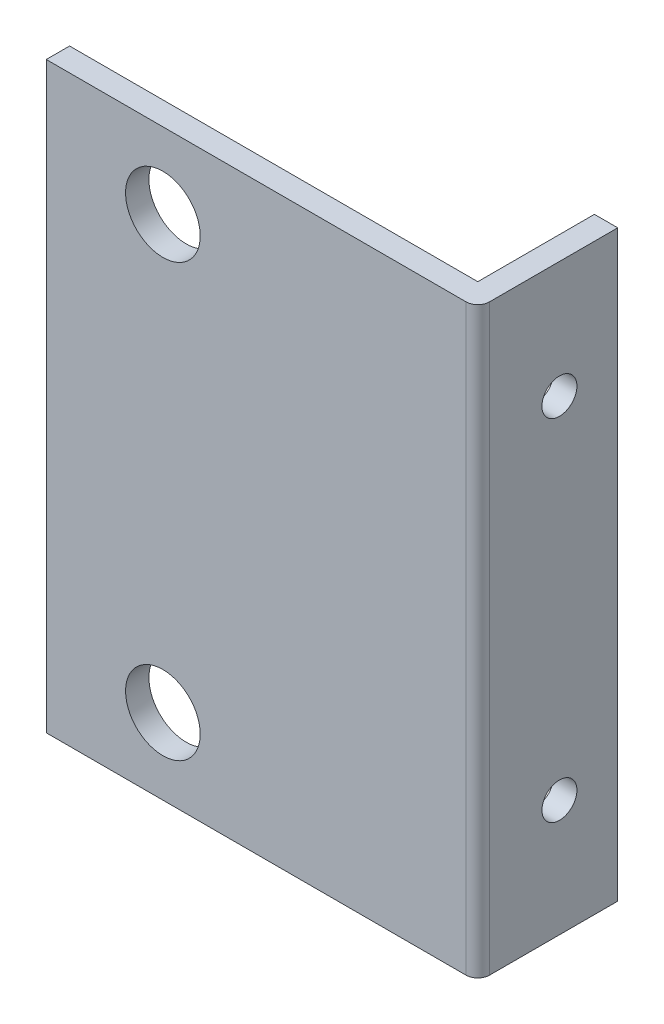
ISO-10303-21;
HEADER;
FILE_DESCRIPTION(('STEP AP214'),'2;1');
FILE_NAME('part.step','',(''),(''),'','','');
FILE_SCHEMA(('AUTOMOTIVE_DESIGN { 1 0 10303 214 1 1 1 1 }'));
ENDSEC;
DATA;
#1=APPLICATION_CONTEXT('core data for automotive mechanical design processes');
#2=APPLICATION_PROTOCOL_DEFINITION('international standard','automotive_design',2000,#1);
#3=PRODUCT_CONTEXT('',#1,'mechanical');
#4=PRODUCT('Part','Part','',(#3));
#5=PRODUCT_RELATED_PRODUCT_CATEGORY('part','',(#4));
#6=PRODUCT_DEFINITION_FORMATION('','',#4);
#7=PRODUCT_DEFINITION_CONTEXT('part definition',#1,'design');
#8=PRODUCT_DEFINITION('design','',#6,#7);
#9=PRODUCT_DEFINITION_SHAPE('','',#8);
#10=(LENGTH_UNIT() NAMED_UNIT(*) SI_UNIT(.MILLI.,.METRE.));
#11=(NAMED_UNIT(*) PLANE_ANGLE_UNIT() SI_UNIT($,.RADIAN.));
#12=(NAMED_UNIT(*) SI_UNIT($,.STERADIAN.) SOLID_ANGLE_UNIT());
#13=UNCERTAINTY_MEASURE_WITH_UNIT(LENGTH_MEASURE(1.E-05),#10,'distance_accuracy_value','');
#14=(GEOMETRIC_REPRESENTATION_CONTEXT(3) GLOBAL_UNCERTAINTY_ASSIGNED_CONTEXT((#13)) GLOBAL_UNIT_ASSIGNED_CONTEXT((#10,
#11,#12)) REPRESENTATION_CONTEXT('',''));
#15=CARTESIAN_POINT('',(0.,0.,0.));
#16=DIRECTION('',(0.,0.,1.));
#17=DIRECTION('',(1.,0.,0.));
#18=AXIS2_PLACEMENT_3D('',#15,#16,#17);
#19=CARTESIAN_POINT('',(0.,50.,-2.));
#20=DIRECTION('',(1.,0.,0.));
#21=DIRECTION('',(0.,0.,-1.));
#22=AXIS2_PLACEMENT_3D('',#19,#20,#21);
#23=PLANE('',#22);
#24=DIRECTION('',(0.,0.,1.));
#25=VECTOR('',#24,1.);
#26=CARTESIAN_POINT('',(0.,0.,-2.));
#27=LINE('',#26,#25);
#28=CARTESIAN_POINT('',(0.,0.,-2.));
#29=VERTEX_POINT('',#28);
#30=CARTESIAN_POINT('',(0.,0.,0.));
#31=VERTEX_POINT('',#30);
#32=EDGE_CURVE('E111',#29,#31,#27,.T.);
#33=ORIENTED_EDGE('',*,*,#32,.T.);
#34=DIRECTION('',(0.,-1.,0.));
#35=VECTOR('',#34,1.);
#36=CARTESIAN_POINT('',(0.,50.,0.));
#37=LINE('',#36,#35);
#38=CARTESIAN_POINT('',(0.,50.,0.));
#39=VERTEX_POINT('',#38);
#40=EDGE_CURVE('E94',#39,#31,#37,.T.);
#41=ORIENTED_EDGE('',*,*,#40,.F.);
#42=DIRECTION('',(0.,0.,1.));
#43=VECTOR('',#42,1.);
#44=CARTESIAN_POINT('',(0.,50.,-2.));
#45=LINE('',#44,#43);
#46=CARTESIAN_POINT('',(0.,50.,-2.));
#47=VERTEX_POINT('',#46);
#48=EDGE_CURVE('E99',#47,#39,#45,.T.);
#49=ORIENTED_EDGE('',*,*,#48,.F.);
#50=DIRECTION('',(0.,-1.,0.));
#51=VECTOR('',#50,1.);
#52=CARTESIAN_POINT('',(0.,50.,-2.));
#53=LINE('',#52,#51);
#54=EDGE_CURVE('E154',#47,#29,#53,.T.);
#55=ORIENTED_EDGE('',*,*,#54,.T.);
#56=EDGE_LOOP('',(#33,#41,#49,#55));
#57=FACE_BOUND('',#56,.T.);
#58=ADVANCED_FACE('F33',(#57),#23,.F.);
#59=CARTESIAN_POINT('',(0.,50.,0.));
#60=DIRECTION('',(0.,0.,-1.));
#61=DIRECTION('',(-1.,0.,0.));
#62=AXIS2_PLACEMENT_3D('',#59,#60,#61);
#63=PLANE('',#62);
#64=CARTESIAN_POINT('',(10.,6.50000000000001,0.));
#65=DIRECTION('',(0.,0.,1.));
#66=DIRECTION('',(-1.,0.,0.));
#67=AXIS2_PLACEMENT_3D('',#64,#65,#66);
#68=CIRCLE('',#67,3.2);
#69=CARTESIAN_POINT('',(6.8,6.50000000000001,0.));
#70=VERTEX_POINT('',#69);
#71=EDGE_CURVE('E143',#70,#70,#68,.T.);
#72=ORIENTED_EDGE('',*,*,#71,.F.);
#73=EDGE_LOOP('',(#72));
#74=FACE_BOUND('',#73,.T.);
#75=CARTESIAN_POINT('',(10.,43.5,0.));
#76=DIRECTION('',(0.,0.,1.));
#77=DIRECTION('',(1.,0.,0.));
#78=AXIS2_PLACEMENT_3D('',#75,#76,#77);
#79=CIRCLE('',#78,3.2);
#80=CARTESIAN_POINT('',(13.2,43.5,0.));
#81=VERTEX_POINT('',#80);
#82=EDGE_CURVE('E133',#81,#81,#79,.T.);
#83=ORIENTED_EDGE('',*,*,#82,.F.);
#84=EDGE_LOOP('',(#83));
#85=FACE_BOUND('',#84,.T.);
#86=DIRECTION('',(1.,0.,0.));
#87=VECTOR('',#86,1.);
#88=CARTESIAN_POINT('',(0.,0.,0.));
#89=LINE('',#88,#87);
#90=CARTESIAN_POINT('',(36.,0.,0.));
#91=VERTEX_POINT('',#90);
#92=EDGE_CURVE('E156',#31,#91,#89,.T.);
#93=ORIENTED_EDGE('',*,*,#92,.T.);
#94=DIRECTION('',(0.,-1.,0.));
#95=VECTOR('',#94,1.);
#96=CARTESIAN_POINT('',(36.,50.,0.));
#97=LINE('',#96,#95);
#98=CARTESIAN_POINT('',(36.,50.,0.));
#99=VERTEX_POINT('',#98);
#100=EDGE_CURVE('E42',#91,#99,#97,.F.);
#101=ORIENTED_EDGE('',*,*,#100,.T.);
#102=DIRECTION('',(1.,0.,0.));
#103=VECTOR('',#102,1.);
#104=CARTESIAN_POINT('',(0.,50.,0.));
#105=LINE('',#104,#103);
#106=EDGE_CURVE('E90',#39,#99,#105,.T.);
#107=ORIENTED_EDGE('',*,*,#106,.F.);
#108=ORIENTED_EDGE('',*,*,#40,.T.);
#109=EDGE_LOOP('',(#93,#101,#107,#108));
#110=FACE_BOUND('',#109,.T.);
#111=ADVANCED_FACE('F92',(#74,#85,#110),#63,.F.);
#112=CARTESIAN_POINT('',(37.,50.,0.));
#113=DIRECTION('',(-1.,0.,0.));
#114=DIRECTION('',(0.,0.,1.));
#115=AXIS2_PLACEMENT_3D('',#112,#113,#114);
#116=PLANE('',#115);
#117=CARTESIAN_POINT('',(37.,10.,-7.));
#118=DIRECTION('',(1.,0.,0.));
#119=DIRECTION('',(0.,0.,1.));
#120=AXIS2_PLACEMENT_3D('',#117,#118,#119);
#121=CIRCLE('',#120,1.5);
#122=CARTESIAN_POINT('',(37.,10.,-5.5));
#123=VERTEX_POINT('',#122);
#124=EDGE_CURVE('E130',#123,#123,#121,.T.);
#125=ORIENTED_EDGE('',*,*,#124,.F.);
#126=EDGE_LOOP('',(#125));
#127=FACE_BOUND('',#126,.T.);
#128=CARTESIAN_POINT('',(37.,40.,-7.));
#129=DIRECTION('',(1.,0.,0.));
#130=DIRECTION('',(0.,0.,-1.));
#131=AXIS2_PLACEMENT_3D('',#128,#129,#130);
#132=CIRCLE('',#131,1.5);
#133=CARTESIAN_POINT('',(37.,40.,-8.5));
#134=VERTEX_POINT('',#133);
#135=EDGE_CURVE('E127',#134,#134,#132,.T.);
#136=ORIENTED_EDGE('',*,*,#135,.F.);
#137=EDGE_LOOP('',(#136));
#138=FACE_BOUND('',#137,.T.);
#139=DIRECTION('',(0.,0.,-1.));
#140=VECTOR('',#139,1.);
#141=CARTESIAN_POINT('',(37.,50.,0.));
#142=LINE('',#141,#140);
#143=CARTESIAN_POINT('',(37.,50.,-1.));
#144=VERTEX_POINT('',#143);
#145=CARTESIAN_POINT('',(37.,50.,-12.));
#146=VERTEX_POINT('',#145);
#147=EDGE_CURVE('E98',#144,#146,#142,.T.);
#148=ORIENTED_EDGE('',*,*,#147,.F.);
#149=DIRECTION('',(0.,-1.,0.));
#150=VECTOR('',#149,1.);
#151=CARTESIAN_POINT('',(37.,50.,-1.));
#152=LINE('',#151,#150);
#153=CARTESIAN_POINT('',(37.,0.,-1.));
#154=VERTEX_POINT('',#153);
#155=EDGE_CURVE('E112',#144,#154,#152,.T.);
#156=ORIENTED_EDGE('',*,*,#155,.T.);
#157=DIRECTION('',(0.,0.,-1.));
#158=VECTOR('',#157,1.);
#159=CARTESIAN_POINT('',(37.,0.,0.));
#160=LINE('',#159,#158);
#161=CARTESIAN_POINT('',(37.,0.,-12.));
#162=VERTEX_POINT('',#161);
#163=EDGE_CURVE('E158',#154,#162,#160,.T.);
#164=ORIENTED_EDGE('',*,*,#163,.T.);
#165=DIRECTION('',(0.,-1.,0.));
#166=VECTOR('',#165,1.);
#167=CARTESIAN_POINT('',(37.,50.,-12.));
#168=LINE('',#167,#166);
#169=EDGE_CURVE('E113',#146,#162,#168,.T.);
#170=ORIENTED_EDGE('',*,*,#169,.F.);
#171=EDGE_LOOP('',(#148,#156,#164,#170));
#172=FACE_BOUND('',#171,.T.);
#173=ADVANCED_FACE('F200',(#127,#138,#172),#116,.F.);
#174=CARTESIAN_POINT('',(37.,50.,-12.));
#175=DIRECTION('',(0.,0.,1.));
#176=DIRECTION('',(1.,0.,0.));
#177=AXIS2_PLACEMENT_3D('',#174,#175,#176);
#178=PLANE('',#177);
#179=DIRECTION('',(-1.,0.,0.));
#180=VECTOR('',#179,1.);
#181=CARTESIAN_POINT('',(37.,0.,-12.));
#182=LINE('',#181,#180);
#183=CARTESIAN_POINT('',(35.,0.,-12.));
#184=VERTEX_POINT('',#183);
#185=EDGE_CURVE('E160',#162,#184,#182,.T.);
#186=ORIENTED_EDGE('',*,*,#185,.T.);
#187=DIRECTION('',(0.,-1.,0.));
#188=VECTOR('',#187,1.);
#189=CARTESIAN_POINT('',(35.,50.,-12.));
#190=LINE('',#189,#188);
#191=CARTESIAN_POINT('',(35.,50.,-12.));
#192=VERTEX_POINT('',#191);
#193=EDGE_CURVE('E118',#192,#184,#190,.T.);
#194=ORIENTED_EDGE('',*,*,#193,.F.);
#195=DIRECTION('',(-1.,0.,0.));
#196=VECTOR('',#195,1.);
#197=CARTESIAN_POINT('',(37.,50.,-12.));
#198=LINE('',#197,#196);
#199=EDGE_CURVE('E149',#146,#192,#198,.T.);
#200=ORIENTED_EDGE('',*,*,#199,.F.);
#201=ORIENTED_EDGE('',*,*,#169,.T.);
#202=EDGE_LOOP('',(#186,#194,#200,#201));
#203=FACE_BOUND('',#202,.T.);
#204=ADVANCED_FACE('F192',(#203),#178,.F.);
#205=CARTESIAN_POINT('',(35.,50.,-12.));
#206=DIRECTION('',(1.,0.,0.));
#207=DIRECTION('',(0.,0.,-1.));
#208=AXIS2_PLACEMENT_3D('',#205,#206,#207);
#209=PLANE('',#208);
#210=CARTESIAN_POINT('',(35.,10.,-7.));
#211=DIRECTION('',(1.,0.,0.));
#212=DIRECTION('',(0.,0.,-1.));
#213=AXIS2_PLACEMENT_3D('',#210,#211,#212);
#214=CIRCLE('',#213,1.5);
#215=CARTESIAN_POINT('',(35.,10.,-8.5));
#216=VERTEX_POINT('',#215);
#217=EDGE_CURVE('E128',#216,#216,#214,.T.);
#218=ORIENTED_EDGE('',*,*,#217,.T.);
#219=EDGE_LOOP('',(#218));
#220=FACE_BOUND('',#219,.T.);
#221=CARTESIAN_POINT('',(35.,40.,-7.));
#222=DIRECTION('',(1.,0.,0.));
#223=DIRECTION('',(0.,0.,-1.));
#224=AXIS2_PLACEMENT_3D('',#221,#222,#223);
#225=CIRCLE('',#224,1.5);
#226=CARTESIAN_POINT('',(35.,40.,-8.5));
#227=VERTEX_POINT('',#226);
#228=EDGE_CURVE('E124',#227,#227,#225,.T.);
#229=ORIENTED_EDGE('',*,*,#228,.T.);
#230=EDGE_LOOP('',(#229));
#231=FACE_BOUND('',#230,.T.);
#232=DIRECTION('',(0.,0.,1.));
#233=VECTOR('',#232,1.);
#234=CARTESIAN_POINT('',(35.,0.,-12.));
#235=LINE('',#234,#233);
#236=CARTESIAN_POINT('',(35.,0.,-2.));
#237=VERTEX_POINT('',#236);
#238=EDGE_CURVE('E162',#184,#237,#235,.T.);
#239=ORIENTED_EDGE('',*,*,#238,.T.);
#240=DIRECTION('',(0.,-1.,0.));
#241=VECTOR('',#240,1.);
#242=CARTESIAN_POINT('',(35.,50.,-2.));
#243=LINE('',#242,#241);
#244=CARTESIAN_POINT('',(35.,50.,-2.));
#245=VERTEX_POINT('',#244);
#246=EDGE_CURVE('E166',#245,#237,#243,.T.);
#247=ORIENTED_EDGE('',*,*,#246,.F.);
#248=DIRECTION('',(0.,0.,1.));
#249=VECTOR('',#248,1.);
#250=CARTESIAN_POINT('',(35.,50.,-12.));
#251=LINE('',#250,#249);
#252=EDGE_CURVE('E151',#192,#245,#251,.T.);
#253=ORIENTED_EDGE('',*,*,#252,.F.);
#254=ORIENTED_EDGE('',*,*,#193,.T.);
#255=EDGE_LOOP('',(#239,#247,#253,#254));
#256=FACE_BOUND('',#255,.T.);
#257=ADVANCED_FACE('F173',(#220,#231,#256),#209,.F.);
#258=CARTESIAN_POINT('',(35.,50.,-2.));
#259=DIRECTION('',(0.,0.,1.));
#260=DIRECTION('',(1.,0.,0.));
#261=AXIS2_PLACEMENT_3D('',#258,#259,#260);
#262=PLANE('',#261);
#263=CARTESIAN_POINT('',(10.,6.50000000000001,-2.));
#264=DIRECTION('',(0.,0.,1.));
#265=DIRECTION('',(1.,0.,0.));
#266=AXIS2_PLACEMENT_3D('',#263,#264,#265);
#267=CIRCLE('',#266,3.2);
#268=CARTESIAN_POINT('',(13.2,6.50000000000001,-2.));
#269=VERTEX_POINT('',#268);
#270=EDGE_CURVE('E37',#269,#269,#267,.T.);
#271=ORIENTED_EDGE('',*,*,#270,.T.);
#272=EDGE_LOOP('',(#271));
#273=FACE_BOUND('',#272,.T.);
#274=CARTESIAN_POINT('',(10.,43.5,-2.));
#275=DIRECTION('',(0.,0.,1.));
#276=DIRECTION('',(1.,0.,0.));
#277=AXIS2_PLACEMENT_3D('',#274,#275,#276);
#278=CIRCLE('',#277,3.2);
#279=CARTESIAN_POINT('',(13.2,43.5,-2.));
#280=VERTEX_POINT('',#279);
#281=EDGE_CURVE('E131',#280,#280,#278,.T.);
#282=ORIENTED_EDGE('',*,*,#281,.T.);
#283=EDGE_LOOP('',(#282));
#284=FACE_BOUND('',#283,.T.);
#285=DIRECTION('',(-1.,0.,0.));
#286=VECTOR('',#285,1.);
#287=CARTESIAN_POINT('',(35.,0.,-2.));
#288=LINE('',#287,#286);
#289=EDGE_CURVE('E108',#237,#29,#288,.T.);
#290=ORIENTED_EDGE('',*,*,#289,.T.);
#291=ORIENTED_EDGE('',*,*,#54,.F.);
#292=DIRECTION('',(-1.,0.,0.));
#293=VECTOR('',#292,1.);
#294=CARTESIAN_POINT('',(35.,50.,-2.));
#295=LINE('',#294,#293);
#296=EDGE_CURVE('E104',#245,#47,#295,.T.);
#297=ORIENTED_EDGE('',*,*,#296,.F.);
#298=ORIENTED_EDGE('',*,*,#246,.T.);
#299=EDGE_LOOP('',(#290,#291,#297,#298));
#300=FACE_BOUND('',#299,.T.);
#301=ADVANCED_FACE('F181',(#273,#284,#300),#262,.F.);
#302=CARTESIAN_POINT('',(0.,50.,0.));
#303=DIRECTION('',(0.,1.,0.));
#304=DIRECTION('',(0.,0.,1.));
#305=AXIS2_PLACEMENT_3D('',#302,#303,#304);
#306=PLANE('',#305);
#307=ORIENTED_EDGE('',*,*,#106,.T.);
#308=CARTESIAN_POINT('',(36.,50.,-1.));
#309=DIRECTION('',(0.,1.,0.));
#310=DIRECTION('',(0.,0.,1.));
#311=AXIS2_PLACEMENT_3D('',#308,#309,#310);
#312=CIRCLE('',#311,1.);
#313=EDGE_CURVE('E11',#99,#144,#312,.T.);
#314=ORIENTED_EDGE('',*,*,#313,.T.);
#315=ORIENTED_EDGE('',*,*,#147,.T.);
#316=ORIENTED_EDGE('',*,*,#199,.T.);
#317=ORIENTED_EDGE('',*,*,#252,.T.);
#318=ORIENTED_EDGE('',*,*,#296,.T.);
#319=ORIENTED_EDGE('',*,*,#48,.T.);
#320=EDGE_LOOP('',(#307,#314,#315,#316,#317,#318,#319));
#321=FACE_BOUND('',#320,.T.);
#322=ADVANCED_FACE('F102',(#321),#306,.T.);
#323=CARTESIAN_POINT('',(0.,0.,0.));
#324=DIRECTION('',(0.,1.,0.));
#325=DIRECTION('',(0.,0.,1.));
#326=AXIS2_PLACEMENT_3D('',#323,#324,#325);
#327=PLANE('',#326);
#328=ORIENTED_EDGE('',*,*,#163,.F.);
#329=CARTESIAN_POINT('',(36.,0.,-1.));
#330=DIRECTION('',(0.,1.,0.));
#331=DIRECTION('',(0.,0.,1.));
#332=AXIS2_PLACEMENT_3D('',#329,#330,#331);
#333=CIRCLE('',#332,1.);
#334=EDGE_CURVE('E57',#154,#91,#333,.F.);
#335=ORIENTED_EDGE('',*,*,#334,.T.);
#336=ORIENTED_EDGE('',*,*,#92,.F.);
#337=ORIENTED_EDGE('',*,*,#32,.F.);
#338=ORIENTED_EDGE('',*,*,#289,.F.);
#339=ORIENTED_EDGE('',*,*,#238,.F.);
#340=ORIENTED_EDGE('',*,*,#185,.F.);
#341=EDGE_LOOP('',(#328,#335,#336,#337,#338,#339,#340));
#342=FACE_BOUND('',#341,.T.);
#343=ADVANCED_FACE('F179',(#342),#327,.F.);
#344=CARTESIAN_POINT('',(36.,50.,-1.));
#345=DIRECTION('',(0.,-1.,0.));
#346=DIRECTION('',(0.,0.,-1.));
#347=AXIS2_PLACEMENT_3D('',#344,#345,#346);
#348=CYLINDRICAL_SURFACE('',#347,1.);
#349=ORIENTED_EDGE('',*,*,#313,.F.);
#350=ORIENTED_EDGE('',*,*,#100,.F.);
#351=ORIENTED_EDGE('',*,*,#334,.F.);
#352=ORIENTED_EDGE('',*,*,#155,.F.);
#353=EDGE_LOOP('',(#349,#350,#351,#352));
#354=FACE_BOUND('',#353,.T.);
#355=ADVANCED_FACE('F35',(#354),#348,.T.);
#356=CARTESIAN_POINT('',(0.,40.,-7.));
#357=DIRECTION('',(1.,0.,0.));
#358=DIRECTION('',(0.,0.,-1.));
#359=AXIS2_PLACEMENT_3D('',#356,#357,#358);
#360=CYLINDRICAL_SURFACE('',#359,1.5);
#361=ORIENTED_EDGE('',*,*,#135,.T.);
#362=EDGE_LOOP('',(#361));
#363=FACE_BOUND('',#362,.T.);
#364=ORIENTED_EDGE('',*,*,#228,.F.);
#365=EDGE_LOOP('',(#364));
#366=FACE_BOUND('',#365,.T.);
#367=ADVANCED_FACE('F216',(#363,#366),#360,.F.);
#368=CARTESIAN_POINT('',(0.,10.,-7.));
#369=DIRECTION('',(1.,0.,0.));
#370=DIRECTION('',(0.,0.,-1.));
#371=AXIS2_PLACEMENT_3D('',#368,#369,#370);
#372=CYLINDRICAL_SURFACE('',#371,1.5);
#373=ORIENTED_EDGE('',*,*,#124,.T.);
#374=EDGE_LOOP('',(#373));
#375=FACE_BOUND('',#374,.T.);
#376=ORIENTED_EDGE('',*,*,#217,.F.);
#377=EDGE_LOOP('',(#376));
#378=FACE_BOUND('',#377,.T.);
#379=ADVANCED_FACE('F221',(#375,#378),#372,.F.);
#380=CARTESIAN_POINT('',(10.,43.5,-12.));
#381=DIRECTION('',(0.,0.,1.));
#382=DIRECTION('',(1.,0.,0.));
#383=AXIS2_PLACEMENT_3D('',#380,#381,#382);
#384=CYLINDRICAL_SURFACE('',#383,3.2);
#385=ORIENTED_EDGE('',*,*,#82,.T.);
#386=EDGE_LOOP('',(#385));
#387=FACE_BOUND('',#386,.T.);
#388=ORIENTED_EDGE('',*,*,#281,.F.);
#389=EDGE_LOOP('',(#388));
#390=FACE_BOUND('',#389,.T.);
#391=ADVANCED_FACE('F229',(#387,#390),#384,.F.);
#392=CARTESIAN_POINT('',(10.,6.50000000000001,-12.));
#393=DIRECTION('',(0.,0.,1.));
#394=DIRECTION('',(1.,0.,0.));
#395=AXIS2_PLACEMENT_3D('',#392,#393,#394);
#396=CYLINDRICAL_SURFACE('',#395,3.2);
#397=ORIENTED_EDGE('',*,*,#71,.T.);
#398=EDGE_LOOP('',(#397));
#399=FACE_BOUND('',#398,.T.);
#400=ORIENTED_EDGE('',*,*,#270,.F.);
#401=EDGE_LOOP('',(#400));
#402=FACE_BOUND('',#401,.T.);
#403=ADVANCED_FACE('F233',(#399,#402),#396,.F.);
#404=CLOSED_SHELL('',(#58,#111,#173,#204,#257,#301,#322,#343,#355,#367,#379,#391,#403));
#405=MANIFOLD_SOLID_BREP('B2',#404);
#406=ADVANCED_BREP_SHAPE_REPRESENTATION('',(#18,#405),#14);
#407=SHAPE_DEFINITION_REPRESENTATION(#9,#406);
ENDSEC;
END-ISO-10303-21;
